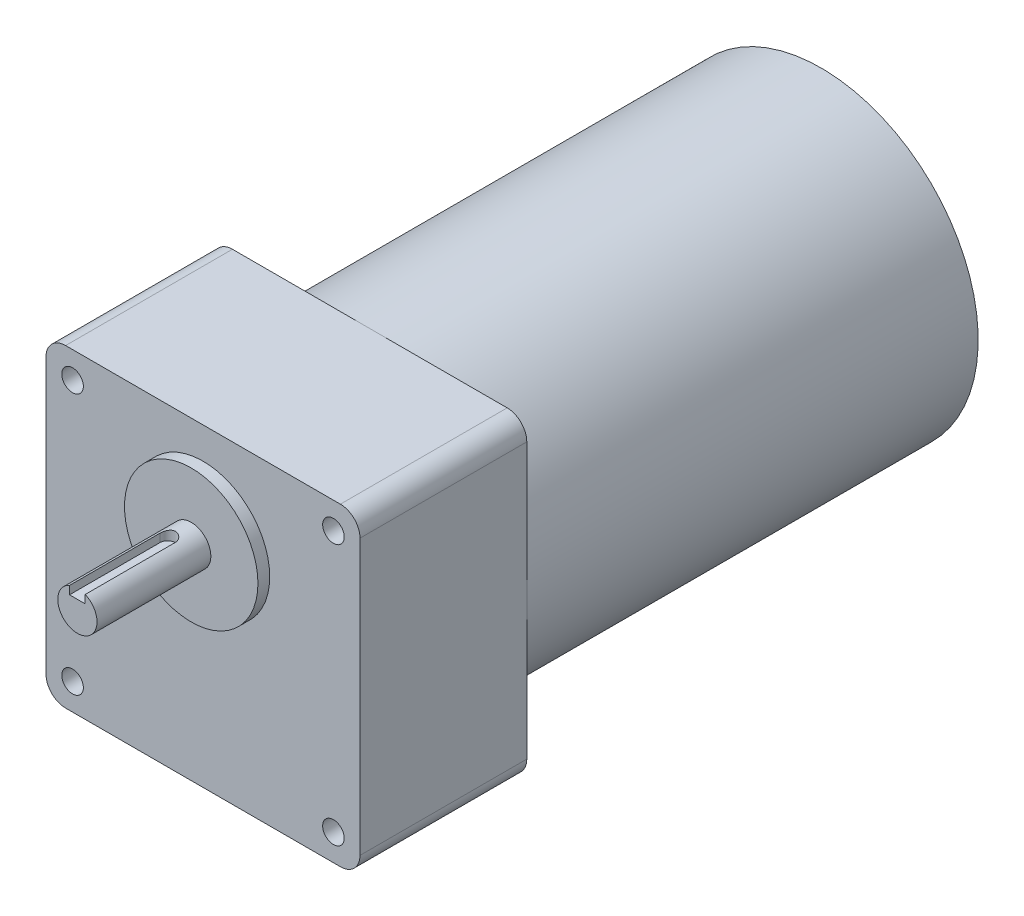
ISO-10303-21;
HEADER;
FILE_DESCRIPTION(('STEP AP214'),'2;1');
FILE_NAME('part.step','',(''),(''),'','','');
FILE_SCHEMA(('AUTOMOTIVE_DESIGN { 1 0 10303 214 1 1 1 1 }'));
ENDSEC;
DATA;
#1=APPLICATION_CONTEXT('core data for automotive mechanical design processes');
#2=APPLICATION_PROTOCOL_DEFINITION('international standard','automotive_design',2000,#1);
#3=PRODUCT_CONTEXT('',#1,'mechanical');
#4=PRODUCT('Part','Part','',(#3));
#5=PRODUCT_RELATED_PRODUCT_CATEGORY('part','',(#4));
#6=PRODUCT_DEFINITION_FORMATION('','',#4);
#7=PRODUCT_DEFINITION_CONTEXT('part definition',#1,'design');
#8=PRODUCT_DEFINITION('design','',#6,#7);
#9=PRODUCT_DEFINITION_SHAPE('','',#8);
#10=(LENGTH_UNIT() NAMED_UNIT(*) SI_UNIT(.MILLI.,.METRE.));
#11=(NAMED_UNIT(*) PLANE_ANGLE_UNIT() SI_UNIT($,.RADIAN.));
#12=(NAMED_UNIT(*) SI_UNIT($,.STERADIAN.) SOLID_ANGLE_UNIT());
#13=UNCERTAINTY_MEASURE_WITH_UNIT(LENGTH_MEASURE(1.E-05),#10,'distance_accuracy_value','');
#14=(GEOMETRIC_REPRESENTATION_CONTEXT(3) GLOBAL_UNCERTAINTY_ASSIGNED_CONTEXT((#13)) GLOBAL_UNIT_ASSIGNED_CONTEXT((#10,
#11,#12)) REPRESENTATION_CONTEXT('',''));
#15=CARTESIAN_POINT('',(0.,0.,0.));
#16=DIRECTION('',(0.,0.,1.));
#17=DIRECTION('',(1.,0.,0.));
#18=AXIS2_PLACEMENT_3D('',#15,#16,#17);
#19=CARTESIAN_POINT('',(0.,0.,-32.5));
#20=DIRECTION('',(0.,0.,-1.));
#21=DIRECTION('',(-1.,0.,0.));
#22=AXIS2_PLACEMENT_3D('',#19,#20,#21);
#23=PLANE('',#22);
#24=CARTESIAN_POINT('',(-33.2340187157677,33.2340187157677,-32.5));
#25=DIRECTION('',(0.,0.,-1.));
#26=DIRECTION('',(-1.,0.,0.));
#27=AXIS2_PLACEMENT_3D('',#24,#25,#26);
#28=CIRCLE('',#27,2.75);
#29=CARTESIAN_POINT('',(-35.9840187157677,33.2340187157677,-32.5));
#30=VERTEX_POINT('',#29);
#31=EDGE_CURVE('E273',#30,#30,#28,.T.);
#32=ORIENTED_EDGE('',*,*,#31,.F.);
#33=EDGE_LOOP('',(#32));
#34=FACE_BOUND('',#33,.T.);
#35=DIRECTION('',(0.,1.,0.));
#36=VECTOR('',#35,1.);
#37=CARTESIAN_POINT('',(-40.,-40.,-32.5));
#38=LINE('',#37,#36);
#39=CARTESIAN_POINT('',(-40.,0.,-32.5));
#40=VERTEX_POINT('',#39);
#41=CARTESIAN_POINT('',(-40.,35.,-32.5));
#42=VERTEX_POINT('',#41);
#43=EDGE_CURVE('E143',#40,#42,#38,.T.);
#44=ORIENTED_EDGE('',*,*,#43,.T.);
#45=CARTESIAN_POINT('',(-35.,35.,-32.5));
#46=DIRECTION('',(0.,0.,-1.));
#47=DIRECTION('',(-1.,0.,0.));
#48=AXIS2_PLACEMENT_3D('',#45,#46,#47);
#49=CIRCLE('',#48,5.);
#50=CARTESIAN_POINT('',(-35.,40.,-32.5));
#51=VERTEX_POINT('',#50);
#52=EDGE_CURVE('E351',#42,#51,#49,.T.);
#53=ORIENTED_EDGE('',*,*,#52,.T.);
#54=DIRECTION('',(1.,0.,0.));
#55=VECTOR('',#54,1.);
#56=CARTESIAN_POINT('',(-40.,40.,-32.5));
#57=LINE('',#56,#55);
#58=CARTESIAN_POINT('',(0.,40.,-32.5));
#59=VERTEX_POINT('',#58);
#60=EDGE_CURVE('E157',#51,#59,#57,.T.);
#61=ORIENTED_EDGE('',*,*,#60,.T.);
#62=CARTESIAN_POINT('',(0.,0.,-32.5));
#63=DIRECTION('',(0.,0.,-1.));
#64=DIRECTION('',(-1.,0.,0.));
#65=AXIS2_PLACEMENT_3D('',#62,#63,#64);
#66=CIRCLE('',#65,40.);
#67=EDGE_CURVE('E155',#40,#59,#66,.T.);
#68=ORIENTED_EDGE('',*,*,#67,.F.);
#69=EDGE_LOOP('',(#44,#53,#61,#68));
#70=FACE_BOUND('',#69,.T.);
#71=ADVANCED_FACE('F33',(#34,#70),#23,.T.);
#72=CARTESIAN_POINT('',(33.2340187157677,33.2340187157677,-32.5));
#73=DIRECTION('',(0.,0.,-1.));
#74=DIRECTION('',(-1.,0.,0.));
#75=AXIS2_PLACEMENT_3D('',#72,#73,#74);
#76=CIRCLE('',#75,2.75);
#77=CARTESIAN_POINT('',(30.4840187157677,33.2340187157677,-32.5));
#78=VERTEX_POINT('',#77);
#79=EDGE_CURVE('E276',#78,#78,#76,.T.);
#80=ORIENTED_EDGE('',*,*,#79,.F.);
#81=EDGE_LOOP('',(#80));
#82=FACE_BOUND('',#81,.T.);
#83=CARTESIAN_POINT('',(35.,40.,-32.5));
#84=VERTEX_POINT('',#83);
#85=EDGE_CURVE('E177',#59,#84,#57,.T.);
#86=ORIENTED_EDGE('',*,*,#85,.T.);
#87=CARTESIAN_POINT('',(35.,35.,-32.5));
#88=DIRECTION('',(0.,0.,-1.));
#89=DIRECTION('',(-1.,0.,0.));
#90=AXIS2_PLACEMENT_3D('',#87,#88,#89);
#91=CIRCLE('',#90,5.);
#92=CARTESIAN_POINT('',(40.,35.,-32.5));
#93=VERTEX_POINT('',#92);
#94=EDGE_CURVE('E11',#84,#93,#91,.T.);
#95=ORIENTED_EDGE('',*,*,#94,.T.);
#96=DIRECTION('',(0.,-1.,0.));
#97=VECTOR('',#96,1.);
#98=CARTESIAN_POINT('',(40.,40.,-32.5));
#99=LINE('',#98,#97);
#100=CARTESIAN_POINT('',(40.,0.,-32.5));
#101=VERTEX_POINT('',#100);
#102=EDGE_CURVE('E178',#93,#101,#99,.T.);
#103=ORIENTED_EDGE('',*,*,#102,.T.);
#104=EDGE_CURVE('E164',#59,#101,#66,.T.);
#105=ORIENTED_EDGE('',*,*,#104,.F.);
#106=EDGE_LOOP('',(#86,#95,#103,#105));
#107=FACE_BOUND('',#106,.T.);
#108=ADVANCED_FACE('F227',(#82,#107),#23,.T.);
#109=CARTESIAN_POINT('',(33.2340187157677,-33.2340187157677,-32.5));
#110=DIRECTION('',(0.,0.,-1.));
#111=DIRECTION('',(-1.,0.,0.));
#112=AXIS2_PLACEMENT_3D('',#109,#110,#111);
#113=CIRCLE('',#112,2.75);
#114=CARTESIAN_POINT('',(30.4840187157677,-33.2340187157677,-32.5));
#115=VERTEX_POINT('',#114);
#116=EDGE_CURVE('E255',#115,#115,#113,.T.);
#117=ORIENTED_EDGE('',*,*,#116,.F.);
#118=EDGE_LOOP('',(#117));
#119=FACE_BOUND('',#118,.T.);
#120=CARTESIAN_POINT('',(40.,-35.,-32.5));
#121=VERTEX_POINT('',#120);
#122=EDGE_CURVE('E176',#101,#121,#99,.T.);
#123=ORIENTED_EDGE('',*,*,#122,.T.);
#124=CARTESIAN_POINT('',(35.,-35.,-32.5));
#125=DIRECTION('',(0.,0.,-1.));
#126=DIRECTION('',(-1.,0.,0.));
#127=AXIS2_PLACEMENT_3D('',#124,#125,#126);
#128=CIRCLE('',#127,5.);
#129=CARTESIAN_POINT('',(35.,-40.,-32.5));
#130=VERTEX_POINT('',#129);
#131=EDGE_CURVE('E41',#121,#130,#128,.T.);
#132=ORIENTED_EDGE('',*,*,#131,.T.);
#133=DIRECTION('',(-1.,0.,0.));
#134=VECTOR('',#133,1.);
#135=CARTESIAN_POINT('',(40.,-40.,-32.5));
#136=LINE('',#135,#134);
#137=CARTESIAN_POINT('',(0.,-40.,-32.5));
#138=VERTEX_POINT('',#137);
#139=EDGE_CURVE('E153',#130,#138,#136,.T.);
#140=ORIENTED_EDGE('',*,*,#139,.T.);
#141=EDGE_CURVE('E168',#101,#138,#66,.T.);
#142=ORIENTED_EDGE('',*,*,#141,.F.);
#143=EDGE_LOOP('',(#123,#132,#140,#142));
#144=FACE_BOUND('',#143,.T.);
#145=ADVANCED_FACE('F232',(#119,#144),#23,.T.);
#146=CARTESIAN_POINT('',(40.,40.,10.));
#147=DIRECTION('',(-1.,0.,0.));
#148=DIRECTION('',(0.,0.,1.));
#149=AXIS2_PLACEMENT_3D('',#146,#147,#148);
#150=PLANE('',#149);
#151=DIRECTION('',(0.,1.,0.));
#152=VECTOR('',#151,1.);
#153=CARTESIAN_POINT('',(40.,40.,10.));
#154=LINE('',#153,#152);
#155=CARTESIAN_POINT('',(40.,-35.,10.));
#156=VERTEX_POINT('',#155);
#157=CARTESIAN_POINT('',(40.,35.,10.));
#158=VERTEX_POINT('',#157);
#159=EDGE_CURVE('E321',#156,#158,#154,.T.);
#160=ORIENTED_EDGE('',*,*,#159,.F.);
#161=DIRECTION('',(0.,0.,-1.));
#162=VECTOR('',#161,1.);
#163=CARTESIAN_POINT('',(40.,-35.,10.));
#164=LINE('',#163,#162);
#165=EDGE_CURVE('E261',#156,#121,#164,.T.);
#166=ORIENTED_EDGE('',*,*,#165,.T.);
#167=ORIENTED_EDGE('',*,*,#122,.F.);
#168=ORIENTED_EDGE('',*,*,#102,.F.);
#169=DIRECTION('',(0.,0.,-1.));
#170=VECTOR('',#169,1.);
#171=CARTESIAN_POINT('',(40.,35.,10.));
#172=LINE('',#171,#170);
#173=EDGE_CURVE('E339',#93,#158,#172,.F.);
#174=ORIENTED_EDGE('',*,*,#173,.T.);
#175=EDGE_LOOP('',(#160,#166,#167,#168,#174));
#176=FACE_BOUND('',#175,.T.);
#177=ADVANCED_FACE('F244',(#176),#150,.F.);
#178=CARTESIAN_POINT('',(-40.,40.,10.));
#179=DIRECTION('',(0.,-1.,0.));
#180=DIRECTION('',(0.,0.,-1.));
#181=AXIS2_PLACEMENT_3D('',#178,#179,#180);
#182=PLANE('',#181);
#183=ORIENTED_EDGE('',*,*,#60,.F.);
#184=DIRECTION('',(0.,0.,-1.));
#185=VECTOR('',#184,1.);
#186=CARTESIAN_POINT('',(-35.,40.,10.));
#187=LINE('',#186,#185);
#188=CARTESIAN_POINT('',(-35.,40.,10.));
#189=VERTEX_POINT('',#188);
#190=EDGE_CURVE('E326',#51,#189,#187,.F.);
#191=ORIENTED_EDGE('',*,*,#190,.T.);
#192=DIRECTION('',(-1.,0.,0.));
#193=VECTOR('',#192,1.);
#194=CARTESIAN_POINT('',(-40.,40.,10.));
#195=LINE('',#194,#193);
#196=CARTESIAN_POINT('',(35.,40.,10.));
#197=VERTEX_POINT('',#196);
#198=EDGE_CURVE('E310',#197,#189,#195,.T.);
#199=ORIENTED_EDGE('',*,*,#198,.F.);
#200=DIRECTION('',(0.,0.,-1.));
#201=VECTOR('',#200,1.);
#202=CARTESIAN_POINT('',(35.,40.,10.));
#203=LINE('',#202,#201);
#204=EDGE_CURVE('E346',#197,#84,#203,.T.);
#205=ORIENTED_EDGE('',*,*,#204,.T.);
#206=ORIENTED_EDGE('',*,*,#85,.F.);
#207=EDGE_LOOP('',(#183,#191,#199,#205,#206));
#208=FACE_BOUND('',#207,.T.);
#209=ADVANCED_FACE('F249',(#208),#182,.F.);
#210=CARTESIAN_POINT('',(-40.,40.,10.));
#211=DIRECTION('',(1.,0.,0.));
#212=DIRECTION('',(0.,1.,0.));
#213=AXIS2_PLACEMENT_3D('',#210,#211,#212);
#214=PLANE('',#213);
#215=DIRECTION('',(0.,-1.,0.));
#216=VECTOR('',#215,1.);
#217=CARTESIAN_POINT('',(-40.,40.,10.));
#218=LINE('',#217,#216);
#219=CARTESIAN_POINT('',(-40.,35.,10.));
#220=VERTEX_POINT('',#219);
#221=CARTESIAN_POINT('',(-40.,-35.,10.));
#222=VERTEX_POINT('',#221);
#223=EDGE_CURVE('E320',#220,#222,#218,.T.);
#224=ORIENTED_EDGE('',*,*,#223,.F.);
#225=DIRECTION('',(0.,0.,-1.));
#226=VECTOR('',#225,1.);
#227=CARTESIAN_POINT('',(-40.,35.,10.));
#228=LINE('',#227,#226);
#229=EDGE_CURVE('E151',#220,#42,#228,.T.);
#230=ORIENTED_EDGE('',*,*,#229,.T.);
#231=ORIENTED_EDGE('',*,*,#43,.F.);
#232=CARTESIAN_POINT('',(-40.,-35.,-32.5));
#233=VERTEX_POINT('',#232);
#234=EDGE_CURVE('E132',#233,#40,#38,.T.);
#235=ORIENTED_EDGE('',*,*,#234,.F.);
#236=DIRECTION('',(0.,0.,-1.));
#237=VECTOR('',#236,1.);
#238=CARTESIAN_POINT('',(-40.,-35.,10.));
#239=LINE('',#238,#237);
#240=EDGE_CURVE('E265',#233,#222,#239,.F.);
#241=ORIENTED_EDGE('',*,*,#240,.T.);
#242=EDGE_LOOP('',(#224,#230,#231,#235,#241));
#243=FACE_BOUND('',#242,.T.);
#244=ADVANCED_FACE('F149',(#243),#214,.F.);
#245=CARTESIAN_POINT('',(-40.,-40.,10.));
#246=DIRECTION('',(0.,1.,0.));
#247=DIRECTION('',(0.,0.,1.));
#248=AXIS2_PLACEMENT_3D('',#245,#246,#247);
#249=PLANE('',#248);
#250=DIRECTION('',(1.,0.,0.));
#251=VECTOR('',#250,1.);
#252=CARTESIAN_POINT('',(-40.,-40.,10.));
#253=LINE('',#252,#251);
#254=CARTESIAN_POINT('',(-35.,-40.,10.));
#255=VERTEX_POINT('',#254);
#256=CARTESIAN_POINT('',(35.,-40.,10.));
#257=VERTEX_POINT('',#256);
#258=EDGE_CURVE('E356',#255,#257,#253,.T.);
#259=ORIENTED_EDGE('',*,*,#258,.F.);
#260=DIRECTION('',(0.,0.,-1.));
#261=VECTOR('',#260,1.);
#262=CARTESIAN_POINT('',(-35.,-40.,10.));
#263=LINE('',#262,#261);
#264=CARTESIAN_POINT('',(-35.,-40.,-32.5));
#265=VERTEX_POINT('',#264);
#266=EDGE_CURVE('E330',#255,#265,#263,.T.);
#267=ORIENTED_EDGE('',*,*,#266,.T.);
#268=EDGE_CURVE('E180',#138,#265,#136,.T.);
#269=ORIENTED_EDGE('',*,*,#268,.F.);
#270=ORIENTED_EDGE('',*,*,#139,.F.);
#271=DIRECTION('',(0.,0.,-1.));
#272=VECTOR('',#271,1.);
#273=CARTESIAN_POINT('',(35.,-40.,10.));
#274=LINE('',#273,#272);
#275=EDGE_CURVE('E327',#130,#257,#274,.F.);
#276=ORIENTED_EDGE('',*,*,#275,.T.);
#277=EDGE_LOOP('',(#259,#267,#269,#270,#276));
#278=FACE_BOUND('',#277,.T.);
#279=ADVANCED_FACE('F299',(#278),#249,.F.);
#280=CARTESIAN_POINT('',(0.,0.,10.));
#281=DIRECTION('',(0.,0.,1.));
#282=DIRECTION('',(1.,0.,0.));
#283=AXIS2_PLACEMENT_3D('',#280,#281,#282);
#284=PLANE('',#283);
#285=CARTESIAN_POINT('',(33.2340187157677,-33.2340187157677,10.));
#286=DIRECTION('',(0.,0.,1.));
#287=DIRECTION('',(1.,0.,0.));
#288=AXIS2_PLACEMENT_3D('',#285,#286,#287);
#289=CIRCLE('',#288,2.75);
#290=CARTESIAN_POINT('',(35.9840187157677,-33.2340187157677,10.));
#291=VERTEX_POINT('',#290);
#292=EDGE_CURVE('E284',#291,#291,#289,.T.);
#293=ORIENTED_EDGE('',*,*,#292,.F.);
#294=EDGE_LOOP('',(#293));
#295=FACE_BOUND('',#294,.T.);
#296=CARTESIAN_POINT('',(-33.2340187157677,-33.2340187157677,10.));
#297=DIRECTION('',(0.,0.,1.));
#298=DIRECTION('',(1.,0.,0.));
#299=AXIS2_PLACEMENT_3D('',#296,#297,#298);
#300=CIRCLE('',#299,2.75);
#301=CARTESIAN_POINT('',(-30.4840187157677,-33.2340187157677,10.));
#302=VERTEX_POINT('',#301);
#303=EDGE_CURVE('E287',#302,#302,#300,.T.);
#304=ORIENTED_EDGE('',*,*,#303,.F.);
#305=EDGE_LOOP('',(#304));
#306=FACE_BOUND('',#305,.T.);
#307=CARTESIAN_POINT('',(-33.2340187157677,33.2340187157677,10.));
#308=DIRECTION('',(0.,0.,1.));
#309=DIRECTION('',(1.,0.,0.));
#310=AXIS2_PLACEMENT_3D('',#307,#308,#309);
#311=CIRCLE('',#310,2.75);
#312=CARTESIAN_POINT('',(-30.4840187157677,33.2340187157677,10.));
#313=VERTEX_POINT('',#312);
#314=EDGE_CURVE('E283',#313,#313,#311,.T.);
#315=ORIENTED_EDGE('',*,*,#314,.F.);
#316=EDGE_LOOP('',(#315));
#317=FACE_BOUND('',#316,.T.);
#318=CARTESIAN_POINT('',(33.2340187157677,33.2340187157677,10.));
#319=DIRECTION('',(0.,0.,1.));
#320=DIRECTION('',(1.,0.,0.));
#321=AXIS2_PLACEMENT_3D('',#318,#319,#320);
#322=CIRCLE('',#321,2.75);
#323=CARTESIAN_POINT('',(35.9840187157677,33.2340187157677,10.));
#324=VERTEX_POINT('',#323);
#325=EDGE_CURVE('E280',#324,#324,#322,.T.);
#326=ORIENTED_EDGE('',*,*,#325,.F.);
#327=EDGE_LOOP('',(#326));
#328=FACE_BOUND('',#327,.T.);
#329=CARTESIAN_POINT('',(0.,15.,10.));
#330=DIRECTION('',(0.,0.,1.));
#331=DIRECTION('',(1.,0.,0.));
#332=AXIS2_PLACEMENT_3D('',#329,#330,#331);
#333=CIRCLE('',#332,17.);
#334=CARTESIAN_POINT('',(17.,15.,10.));
#335=VERTEX_POINT('',#334);
#336=EDGE_CURVE('E307',#335,#335,#333,.T.);
#337=ORIENTED_EDGE('',*,*,#336,.F.);
#338=EDGE_LOOP('',(#337));
#339=FACE_BOUND('',#338,.T.);
#340=ORIENTED_EDGE('',*,*,#198,.T.);
#341=CARTESIAN_POINT('',(-35.,35.,10.));
#342=DIRECTION('',(0.,0.,1.));
#343=DIRECTION('',(1.,0.,0.));
#344=AXIS2_PLACEMENT_3D('',#341,#342,#343);
#345=CIRCLE('',#344,5.);
#346=EDGE_CURVE('E313',#189,#220,#345,.T.);
#347=ORIENTED_EDGE('',*,*,#346,.T.);
#348=ORIENTED_EDGE('',*,*,#223,.T.);
#349=CARTESIAN_POINT('',(-35.,-35.,10.));
#350=DIRECTION('',(0.,0.,1.));
#351=DIRECTION('',(1.,0.,0.));
#352=AXIS2_PLACEMENT_3D('',#349,#350,#351);
#353=CIRCLE('',#352,5.);
#354=EDGE_CURVE('E328',#222,#255,#353,.T.);
#355=ORIENTED_EDGE('',*,*,#354,.T.);
#356=ORIENTED_EDGE('',*,*,#258,.T.);
#357=CARTESIAN_POINT('',(35.,-35.,10.));
#358=DIRECTION('',(0.,0.,1.));
#359=DIRECTION('',(1.,0.,0.));
#360=AXIS2_PLACEMENT_3D('',#357,#358,#359);
#361=CIRCLE('',#360,5.);
#362=EDGE_CURVE('E332',#257,#156,#361,.T.);
#363=ORIENTED_EDGE('',*,*,#362,.T.);
#364=ORIENTED_EDGE('',*,*,#159,.T.);
#365=CARTESIAN_POINT('',(35.,35.,10.));
#366=DIRECTION('',(0.,0.,1.));
#367=DIRECTION('',(1.,0.,0.));
#368=AXIS2_PLACEMENT_3D('',#365,#366,#367);
#369=CIRCLE('',#368,5.);
#370=EDGE_CURVE('E316',#158,#197,#369,.T.);
#371=ORIENTED_EDGE('',*,*,#370,.T.);
#372=EDGE_LOOP('',(#340,#347,#348,#355,#356,#363,#364,#371));
#373=FACE_BOUND('',#372,.T.);
#374=ADVANCED_FACE('F295',(#295,#306,#317,#328,#339,#373),#284,.T.);
#375=CARTESIAN_POINT('',(0.,15.,13.));
#376=DIRECTION('',(0.,0.,-1.));
#377=DIRECTION('',(-1.,0.,0.));
#378=AXIS2_PLACEMENT_3D('',#375,#376,#377);
#379=CYLINDRICAL_SURFACE('',#378,17.);
#380=CARTESIAN_POINT('',(0.,15.,13.));
#381=DIRECTION('',(0.,0.,1.));
#382=DIRECTION('',(1.,0.,0.));
#383=AXIS2_PLACEMENT_3D('',#380,#381,#382);
#384=CIRCLE('',#383,17.);
#385=CARTESIAN_POINT('',(17.,15.,13.));
#386=VERTEX_POINT('',#385);
#387=EDGE_CURVE('E344',#386,#386,#384,.T.);
#388=ORIENTED_EDGE('',*,*,#387,.F.);
#389=EDGE_LOOP('',(#388));
#390=FACE_BOUND('',#389,.T.);
#391=ORIENTED_EDGE('',*,*,#336,.T.);
#392=EDGE_LOOP('',(#391));
#393=FACE_BOUND('',#392,.T.);
#394=ADVANCED_FACE('F298',(#390,#393),#379,.T.);
#395=CARTESIAN_POINT('',(0.,15.,13.));
#396=DIRECTION('',(0.,0.,1.));
#397=DIRECTION('',(1.,0.,0.));
#398=AXIS2_PLACEMENT_3D('',#395,#396,#397);
#399=PLANE('',#398);
#400=CARTESIAN_POINT('',(0.,15.,13.));
#401=DIRECTION('',(0.,0.,1.));
#402=DIRECTION('',(1.,0.,0.));
#403=AXIS2_PLACEMENT_3D('',#400,#401,#402);
#404=CIRCLE('',#403,5.);
#405=CARTESIAN_POINT('',(5.,15.,13.));
#406=VERTEX_POINT('',#405);
#407=EDGE_CURVE('E170',#406,#406,#404,.T.);
#408=ORIENTED_EDGE('',*,*,#407,.F.);
#409=EDGE_LOOP('',(#408));
#410=FACE_BOUND('',#409,.T.);
#411=ORIENTED_EDGE('',*,*,#387,.T.);
#412=EDGE_LOOP('',(#411));
#413=FACE_BOUND('',#412,.T.);
#414=ADVANCED_FACE('F223',(#410,#413),#399,.T.);
#415=CARTESIAN_POINT('',(0.,15.,42.));
#416=DIRECTION('',(0.,0.,-1.));
#417=DIRECTION('',(-1.,0.,0.));
#418=AXIS2_PLACEMENT_3D('',#415,#416,#417);
#419=CYLINDRICAL_SURFACE('',#418,5.);
#420=DIRECTION('',(0.,0.,-1.));
#421=VECTOR('',#420,1.);
#422=CARTESIAN_POINT('',(-2.,19.5825756949558,42.));
#423=LINE('',#422,#421);
#424=CARTESIAN_POINT('',(-2.,19.5825756949558,42.));
#425=VERTEX_POINT('',#424);
#426=CARTESIAN_POINT('',(-2.,19.5825756949558,19.));
#427=VERTEX_POINT('',#426);
#428=EDGE_CURVE('E367',#425,#427,#423,.T.);
#429=ORIENTED_EDGE('',*,*,#428,.T.);
#430=CARTESIAN_POINT('',(-2.,19.5825756949558,19.));
#431=CARTESIAN_POINT('',(-2.00000798036347,19.5825646447038,18.9461941474974));
#432=CARTESIAN_POINT('',(-1.99782891366025,19.5835230607732,18.8923943344424));
#433=CARTESIAN_POINT('',(-1.98915905973447,19.5872962541754,18.7852287017453));
#434=CARTESIAN_POINT('',(-1.98266991468792,19.5901103244855,18.731862724644));
#435=CARTESIAN_POINT('',(-1.9654760367637,19.5974978292064,18.6261531784412));
#436=CARTESIAN_POINT('',(-1.95478796820434,19.6020643071753,18.573806415956));
#437=CARTESIAN_POINT('',(-1.9293163019066,19.6128005329668,18.4702992282855));
#438=CARTESIAN_POINT('',(-1.9145324541709,19.618970378654,18.4191388757228));
#439=CARTESIAN_POINT('',(-1.86426971793523,19.6395929124842,18.268064149418));
#440=CARTESIAN_POINT('',(-1.82284489460008,19.6561744915743,18.1703457693103));
#441=CARTESIAN_POINT('',(-1.72548191592176,19.6931237076538,17.9832044199174));
#442=CARTESIAN_POINT('',(-1.66952996336925,19.7134949386401,17.8937894470383));
#443=CARTESIAN_POINT('',(-1.54131835736854,19.7570099940211,17.7207376033258));
#444=CARTESIAN_POINT('',(-1.4683691399273,19.7802424563552,17.6376327830798));
#445=CARTESIAN_POINT('',(-1.30969646176209,19.8261279054866,17.4844597277893));
#446=CARTESIAN_POINT('',(-1.22397038499682,19.8487807724972,17.4143941691343));
#447=CARTESIAN_POINT('',(-1.03800590808969,19.8920341710608,17.2865936058044));
#448=CARTESIAN_POINT('',(-0.937327933050965,19.9125182454353,17.2294551907381));
#449=CARTESIAN_POINT('',(-0.726824143246712,19.94803944125,17.1331559273114));
#450=CARTESIAN_POINT('',(-0.617002169026246,19.9630788354418,17.0939875759483));
#451=CARTESIAN_POINT('',(-0.396967441295692,19.9853831465382,17.0366587986894));
#452=CARTESIAN_POINT('',(-0.28703105452306,19.9929892254793,17.0175730490943));
#453=CARTESIAN_POINT('',(-0.0652684304565162,20.0008031020109,16.9979715200544));
#454=CARTESIAN_POINT('',(0.0465571232841648,20.0010135205303,16.9974491619765));
#455=CARTESIAN_POINT('',(0.262233376226783,19.994219600453,17.0144828391599));
#456=CARTESIAN_POINT('',(0.36617920250679,19.9876198558546,17.031025046674));
#457=CARTESIAN_POINT('',(0.569674786500929,19.9684927044145,17.0799934270535));
#458=CARTESIAN_POINT('',(0.669224295072842,19.9559649620993,17.1124204988686));
#459=CARTESIAN_POINT('',(0.862897539070296,19.9259683059879,17.1926362964245));
#460=CARTESIAN_POINT('',(0.95691685136644,19.9084277475585,17.2406492408105));
#461=CARTESIAN_POINT('',(1.13580746919776,19.8701460200804,17.3504645885952));
#462=CARTESIAN_POINT('',(1.22067554984698,19.8494037289645,17.4122718296906));
#463=CARTESIAN_POINT('',(1.38476339273627,19.8052178274614,17.5526441802585));
#464=CARTESIAN_POINT('',(1.4632477030894,19.7816862717288,17.63204247467));
#465=CARTESIAN_POINT('',(1.60609926099478,19.7356195058465,17.8029800951477));
#466=CARTESIAN_POINT('',(1.67046007709005,19.7130847533278,17.8945249220943));
#467=CARTESIAN_POINT('',(1.78493657933605,19.6709568885602,18.0904702840212));
#468=CARTESIAN_POINT('',(1.83458932217622,19.6514670215058,18.1951648366602));
#469=CARTESIAN_POINT('',(1.91521298357264,19.6188610505958,18.4123615244295));
#470=CARTESIAN_POINT('',(1.94621696002208,19.6057336762874,18.5248494473383));
#471=CARTESIAN_POINT('',(1.9781058182572,19.5920830352949,18.698743634158));
#472=CARTESIAN_POINT('',(1.98630505165979,19.5885343768053,18.7586575493013));
#473=CARTESIAN_POINT('',(1.99725282103812,19.5837754031439,18.8790350189955));
#474=CARTESIAN_POINT('',(2.00000471568568,19.5825636471174,18.9394982117578));
#475=CARTESIAN_POINT('',(2.,19.5825756949558,19.));
#476=B_SPLINE_CURVE_WITH_KNOTS('',3,(#430,#431,#432,#433,#434,#435,#436,#437,#438,#439,#440,
#441,#442,#443,#444,#445,#446,#447,#448,#449,#450,#451,#452,#453,#454,#455,#456,#457,#458,#459,
#460,#461,#462,#463,#464,#465,#466,#467,#468,#469,#470,#471,#472,#473,#474,#475),.UNSPECIFIED.,
.F.,.F.,(4,2,2,2,2,2,2,2,2,2,2,2,2,2,2,2,2,2,2,2,2,2,4),(0.,0.161354853098821,0.322648263883208,
0.48330791125188,0.643977367092306,0.964683001739093,1.28569434942626,1.62318047995498,
1.96073580539191,2.31162858925763,2.66237473197322,2.9961387650427,3.32978451514656,
3.64468915259535,3.95961161305654,4.27928176927547,4.59906421133019,4.93981874675153,
5.28072813203934,5.63144241548463,5.98153315592125,6.16300192557813,6.34435877193561),.UNSPECIFIED.);
#477=CARTESIAN_POINT('',(2.,19.5825756949558,19.));
#478=VERTEX_POINT('',#477);
#479=EDGE_CURVE('E184',#427,#478,#476,.T.);
#480=ORIENTED_EDGE('',*,*,#479,.T.);
#481=DIRECTION('',(0.,0.,-1.));
#482=VECTOR('',#481,1.);
#483=CARTESIAN_POINT('',(2.,19.5825756949558,42.));
#484=LINE('',#483,#482);
#485=CARTESIAN_POINT('',(2.,19.5825756949558,42.));
#486=VERTEX_POINT('',#485);
#487=EDGE_CURVE('E370',#478,#486,#484,.F.);
#488=ORIENTED_EDGE('',*,*,#487,.T.);
#489=CARTESIAN_POINT('',(0.,15.,42.));
#490=DIRECTION('',(0.,0.,1.));
#491=DIRECTION('',(1.,0.,0.));
#492=AXIS2_PLACEMENT_3D('',#489,#490,#491);
#493=CIRCLE('',#492,5.);
#494=EDGE_CURVE('E362',#425,#486,#493,.T.);
#495=ORIENTED_EDGE('',*,*,#494,.F.);
#496=EDGE_LOOP('',(#429,#480,#488,#495));
#497=FACE_BOUND('',#496,.T.);
#498=ORIENTED_EDGE('',*,*,#407,.T.);
#499=EDGE_LOOP('',(#498));
#500=FACE_BOUND('',#499,.T.);
#501=ADVANCED_FACE('F195',(#497,#500),#419,.T.);
#502=CARTESIAN_POINT('',(0.,15.,42.));
#503=DIRECTION('',(0.,0.,1.));
#504=DIRECTION('',(1.,0.,0.));
#505=AXIS2_PLACEMENT_3D('',#502,#503,#504);
#506=PLANE('',#505);
#507=DIRECTION('',(0.,-1.,0.));
#508=VECTOR('',#507,1.);
#509=CARTESIAN_POINT('',(-2.,15.,42.));
#510=LINE('',#509,#508);
#511=CARTESIAN_POINT('',(-2.,17.5,42.));
#512=VERTEX_POINT('',#511);
#513=EDGE_CURVE('E169',#425,#512,#510,.T.);
#514=ORIENTED_EDGE('',*,*,#513,.F.);
#515=ORIENTED_EDGE('',*,*,#494,.T.);
#516=DIRECTION('',(0.,1.,0.));
#517=VECTOR('',#516,1.);
#518=CARTESIAN_POINT('',(2.,20.9126834756614,42.));
#519=LINE('',#518,#517);
#520=CARTESIAN_POINT('',(2.,17.5,42.));
#521=VERTEX_POINT('',#520);
#522=EDGE_CURVE('E192',#521,#486,#519,.T.);
#523=ORIENTED_EDGE('',*,*,#522,.F.);
#524=DIRECTION('',(1.,0.,0.));
#525=VECTOR('',#524,1.);
#526=CARTESIAN_POINT('',(0.,17.5,42.));
#527=LINE('',#526,#525);
#528=EDGE_CURVE('E379',#512,#521,#527,.T.);
#529=ORIENTED_EDGE('',*,*,#528,.F.);
#530=EDGE_LOOP('',(#514,#515,#523,#529));
#531=FACE_BOUND('',#530,.T.);
#532=ADVANCED_FACE('F214',(#531),#506,.T.);
#533=CARTESIAN_POINT('',(-2.,17.5,19.));
#534=DIRECTION('',(-1.,0.,0.));
#535=DIRECTION('',(0.,0.,1.));
#536=AXIS2_PLACEMENT_3D('',#533,#534,#535);
#537=PLANE('',#536);
#538=ORIENTED_EDGE('',*,*,#513,.T.);
#539=DIRECTION('',(0.,0.,1.));
#540=VECTOR('',#539,1.);
#541=CARTESIAN_POINT('',(-2.,17.5,19.));
#542=LINE('',#541,#540);
#543=CARTESIAN_POINT('',(-2.,17.5,19.));
#544=VERTEX_POINT('',#543);
#545=EDGE_CURVE('E373',#544,#512,#542,.T.);
#546=ORIENTED_EDGE('',*,*,#545,.F.);
#547=DIRECTION('',(0.,-1.,0.));
#548=VECTOR('',#547,1.);
#549=CARTESIAN_POINT('',(-2.,17.5,19.));
#550=LINE('',#549,#548);
#551=EDGE_CURVE('E376',#427,#544,#550,.T.);
#552=ORIENTED_EDGE('',*,*,#551,.F.);
#553=ORIENTED_EDGE('',*,*,#428,.F.);
#554=EDGE_LOOP('',(#538,#546,#552,#553));
#555=FACE_BOUND('',#554,.T.);
#556=ADVANCED_FACE('F211',(#555),#537,.F.);
#557=CARTESIAN_POINT('',(2.,20.9126834756614,19.));
#558=DIRECTION('',(1.,0.,0.));
#559=DIRECTION('',(0.,0.,-1.));
#560=AXIS2_PLACEMENT_3D('',#557,#558,#559);
#561=PLANE('',#560);
#562=DIRECTION('',(0.,1.,0.));
#563=VECTOR('',#562,1.);
#564=CARTESIAN_POINT('',(2.,20.9126834756614,19.));
#565=LINE('',#564,#563);
#566=CARTESIAN_POINT('',(2.,17.5,19.));
#567=VERTEX_POINT('',#566);
#568=EDGE_CURVE('E193',#567,#478,#565,.T.);
#569=ORIENTED_EDGE('',*,*,#568,.F.);
#570=DIRECTION('',(0.,0.,1.));
#571=VECTOR('',#570,1.);
#572=CARTESIAN_POINT('',(2.,17.5,19.));
#573=LINE('',#572,#571);
#574=EDGE_CURVE('E374',#567,#521,#573,.T.);
#575=ORIENTED_EDGE('',*,*,#574,.T.);
#576=ORIENTED_EDGE('',*,*,#522,.T.);
#577=ORIENTED_EDGE('',*,*,#487,.F.);
#578=EDGE_LOOP('',(#569,#575,#576,#577));
#579=FACE_BOUND('',#578,.T.);
#580=ADVANCED_FACE('F209',(#579),#561,.F.);
#581=CARTESIAN_POINT('',(0.,17.5,19.));
#582=DIRECTION('',(0.,-1.,0.));
#583=DIRECTION('',(0.,0.,-1.));
#584=AXIS2_PLACEMENT_3D('',#581,#582,#583);
#585=PLANE('',#584);
#586=ORIENTED_EDGE('',*,*,#528,.T.);
#587=ORIENTED_EDGE('',*,*,#574,.F.);
#588=CARTESIAN_POINT('',(0.,17.5,19.));
#589=DIRECTION('',(0.,1.,0.));
#590=DIRECTION('',(0.,0.,-1.));
#591=AXIS2_PLACEMENT_3D('',#588,#589,#590);
#592=CIRCLE('',#591,2.);
#593=EDGE_CURVE('E142',#567,#544,#592,.T.);
#594=ORIENTED_EDGE('',*,*,#593,.T.);
#595=ORIENTED_EDGE('',*,*,#545,.T.);
#596=EDGE_LOOP('',(#586,#587,#594,#595));
#597=FACE_BOUND('',#596,.T.);
#598=ADVANCED_FACE('F204',(#597),#585,.F.);
#599=CARTESIAN_POINT('',(0.,17.5,19.));
#600=DIRECTION('',(0.,1.,0.));
#601=DIRECTION('',(0.,0.,1.));
#602=AXIS2_PLACEMENT_3D('',#599,#600,#601);
#603=CYLINDRICAL_SURFACE('',#602,2.);
#604=ORIENTED_EDGE('',*,*,#551,.T.);
#605=ORIENTED_EDGE('',*,*,#593,.F.);
#606=ORIENTED_EDGE('',*,*,#568,.T.);
#607=ORIENTED_EDGE('',*,*,#479,.F.);
#608=EDGE_LOOP('',(#604,#605,#606,#607));
#609=FACE_BOUND('',#608,.T.);
#610=ADVANCED_FACE('F199',(#609),#603,.F.);
#611=CARTESIAN_POINT('',(-33.2340187157677,-33.2340187157677,-32.5));
#612=DIRECTION('',(0.,0.,-1.));
#613=DIRECTION('',(-1.,0.,0.));
#614=AXIS2_PLACEMENT_3D('',#611,#612,#613);
#615=CIRCLE('',#614,2.75);
#616=CARTESIAN_POINT('',(-35.9840187157677,-33.2340187157677,-32.5));
#617=VERTEX_POINT('',#616);
#618=EDGE_CURVE('E279',#617,#617,#615,.T.);
#619=ORIENTED_EDGE('',*,*,#618,.F.);
#620=EDGE_LOOP('',(#619));
#621=FACE_BOUND('',#620,.T.);
#622=ORIENTED_EDGE('',*,*,#268,.T.);
#623=CARTESIAN_POINT('',(-35.,-35.,-32.5));
#624=DIRECTION('',(0.,0.,-1.));
#625=DIRECTION('',(-1.,0.,0.));
#626=AXIS2_PLACEMENT_3D('',#623,#624,#625);
#627=CIRCLE('',#626,5.);
#628=EDGE_CURVE('E139',#265,#233,#627,.T.);
#629=ORIENTED_EDGE('',*,*,#628,.T.);
#630=ORIENTED_EDGE('',*,*,#234,.T.);
#631=EDGE_CURVE('E137',#138,#40,#66,.T.);
#632=ORIENTED_EDGE('',*,*,#631,.F.);
#633=EDGE_LOOP('',(#622,#629,#630,#632));
#634=FACE_BOUND('',#633,.T.);
#635=ADVANCED_FACE('F135',(#621,#634),#23,.T.);
#636=CARTESIAN_POINT('',(0.,0.,-147.5));
#637=DIRECTION('',(0.,0.,1.));
#638=DIRECTION('',(1.,0.,0.));
#639=AXIS2_PLACEMENT_3D('',#636,#637,#638);
#640=CYLINDRICAL_SURFACE('',#639,40.);
#641=CARTESIAN_POINT('',(0.,0.,-147.5));
#642=DIRECTION('',(0.,0.,-1.));
#643=DIRECTION('',(-1.,0.,0.));
#644=AXIS2_PLACEMENT_3D('',#641,#642,#643);
#645=CIRCLE('',#644,40.);
#646=CARTESIAN_POINT('',(-40.,0.,-147.5));
#647=VERTEX_POINT('',#646);
#648=EDGE_CURVE('E161',#647,#647,#645,.T.);
#649=ORIENTED_EDGE('',*,*,#648,.F.);
#650=EDGE_LOOP('',(#649));
#651=FACE_BOUND('',#650,.T.);
#652=ORIENTED_EDGE('',*,*,#67,.T.);
#653=ORIENTED_EDGE('',*,*,#104,.T.);
#654=ORIENTED_EDGE('',*,*,#141,.T.);
#655=ORIENTED_EDGE('',*,*,#631,.T.);
#656=EDGE_LOOP('',(#652,#653,#654,#655));
#657=FACE_BOUND('',#656,.T.);
#658=ADVANCED_FACE('F166',(#651,#657),#640,.T.);
#659=CARTESIAN_POINT('',(0.,0.,-147.5));
#660=DIRECTION('',(0.,0.,-1.));
#661=DIRECTION('',(-1.,0.,0.));
#662=AXIS2_PLACEMENT_3D('',#659,#660,#661);
#663=PLANE('',#662);
#664=CARTESIAN_POINT('',(0.,0.,-147.5));
#665=DIRECTION('',(0.,0.,-1.));
#666=DIRECTION('',(-1.,0.,0.));
#667=AXIS2_PLACEMENT_3D('',#664,#665,#666);
#668=CIRCLE('',#667,14.);
#669=CARTESIAN_POINT('',(-14.,0.,-147.5));
#670=VERTEX_POINT('',#669);
#671=EDGE_CURVE('E263',#670,#670,#668,.T.);
#672=ORIENTED_EDGE('',*,*,#671,.F.);
#673=EDGE_LOOP('',(#672));
#674=FACE_BOUND('',#673,.T.);
#675=ORIENTED_EDGE('',*,*,#648,.T.);
#676=EDGE_LOOP('',(#675));
#677=FACE_BOUND('',#676,.T.);
#678=ADVANCED_FACE('F240',(#674,#677),#663,.T.);
#679=CARTESIAN_POINT('',(0.,0.,-152.5));
#680=DIRECTION('',(0.,0.,1.));
#681=DIRECTION('',(1.,0.,0.));
#682=AXIS2_PLACEMENT_3D('',#679,#680,#681);
#683=CYLINDRICAL_SURFACE('',#682,14.);
#684=CARTESIAN_POINT('',(0.,0.,-152.5));
#685=DIRECTION('',(0.,0.,-1.));
#686=DIRECTION('',(-1.,0.,0.));
#687=AXIS2_PLACEMENT_3D('',#684,#685,#686);
#688=CIRCLE('',#687,14.);
#689=CARTESIAN_POINT('',(-14.,0.,-152.5));
#690=VERTEX_POINT('',#689);
#691=EDGE_CURVE('E162',#690,#690,#688,.T.);
#692=ORIENTED_EDGE('',*,*,#691,.F.);
#693=EDGE_LOOP('',(#692));
#694=FACE_BOUND('',#693,.T.);
#695=ORIENTED_EDGE('',*,*,#671,.T.);
#696=EDGE_LOOP('',(#695));
#697=FACE_BOUND('',#696,.T.);
#698=ADVANCED_FACE('F546',(#694,#697),#683,.T.);
#699=CARTESIAN_POINT('',(0.,0.,-152.5));
#700=DIRECTION('',(0.,0.,-1.));
#701=DIRECTION('',(-1.,0.,0.));
#702=AXIS2_PLACEMENT_3D('',#699,#700,#701);
#703=PLANE('',#702);
#704=ORIENTED_EDGE('',*,*,#691,.T.);
#705=EDGE_LOOP('',(#704));
#706=FACE_BOUND('',#705,.T.);
#707=ADVANCED_FACE('F536',(#706),#703,.T.);
#708=CARTESIAN_POINT('',(-33.2340187157677,-33.2340187157677,-152.5));
#709=DIRECTION('',(0.,0.,1.));
#710=DIRECTION('',(1.,0.,0.));
#711=AXIS2_PLACEMENT_3D('',#708,#709,#710);
#712=CYLINDRICAL_SURFACE('',#711,2.75);
#713=ORIENTED_EDGE('',*,*,#618,.T.);
#714=EDGE_LOOP('',(#713));
#715=FACE_BOUND('',#714,.T.);
#716=ORIENTED_EDGE('',*,*,#303,.T.);
#717=EDGE_LOOP('',(#716));
#718=FACE_BOUND('',#717,.T.);
#719=ADVANCED_FACE('F526',(#715,#718),#712,.F.);
#720=CARTESIAN_POINT('',(33.2340187157677,33.2340187157677,-152.5));
#721=DIRECTION('',(0.,0.,1.));
#722=DIRECTION('',(1.,0.,0.));
#723=AXIS2_PLACEMENT_3D('',#720,#721,#722);
#724=CYLINDRICAL_SURFACE('',#723,2.75);
#725=ORIENTED_EDGE('',*,*,#79,.T.);
#726=EDGE_LOOP('',(#725));
#727=FACE_BOUND('',#726,.T.);
#728=ORIENTED_EDGE('',*,*,#325,.T.);
#729=EDGE_LOOP('',(#728));
#730=FACE_BOUND('',#729,.T.);
#731=ADVANCED_FACE('F516',(#727,#730),#724,.F.);
#732=CARTESIAN_POINT('',(-33.2340187157677,33.2340187157677,-152.5));
#733=DIRECTION('',(0.,0.,1.));
#734=DIRECTION('',(1.,0.,0.));
#735=AXIS2_PLACEMENT_3D('',#732,#733,#734);
#736=CYLINDRICAL_SURFACE('',#735,2.75);
#737=ORIENTED_EDGE('',*,*,#31,.T.);
#738=EDGE_LOOP('',(#737));
#739=FACE_BOUND('',#738,.T.);
#740=ORIENTED_EDGE('',*,*,#314,.T.);
#741=EDGE_LOOP('',(#740));
#742=FACE_BOUND('',#741,.T.);
#743=ADVANCED_FACE('F293',(#739,#742),#736,.F.);
#744=CARTESIAN_POINT('',(33.2340187157677,-33.2340187157677,-152.5));
#745=DIRECTION('',(0.,0.,1.));
#746=DIRECTION('',(1.,0.,0.));
#747=AXIS2_PLACEMENT_3D('',#744,#745,#746);
#748=CYLINDRICAL_SURFACE('',#747,2.75);
#749=ORIENTED_EDGE('',*,*,#116,.T.);
#750=EDGE_LOOP('',(#749));
#751=FACE_BOUND('',#750,.T.);
#752=ORIENTED_EDGE('',*,*,#292,.T.);
#753=EDGE_LOOP('',(#752));
#754=FACE_BOUND('',#753,.T.);
#755=ADVANCED_FACE('F414',(#751,#754),#748,.F.);
#756=CARTESIAN_POINT('',(-35.,35.,10.));
#757=DIRECTION('',(0.,0.,-1.));
#758=DIRECTION('',(-1.,0.,0.));
#759=AXIS2_PLACEMENT_3D('',#756,#757,#758);
#760=CYLINDRICAL_SURFACE('',#759,5.);
#761=ORIENTED_EDGE('',*,*,#346,.F.);
#762=ORIENTED_EDGE('',*,*,#190,.F.);
#763=ORIENTED_EDGE('',*,*,#52,.F.);
#764=ORIENTED_EDGE('',*,*,#229,.F.);
#765=EDGE_LOOP('',(#761,#762,#763,#764));
#766=FACE_BOUND('',#765,.T.);
#767=ADVANCED_FACE('F325',(#766),#760,.T.);
#768=CARTESIAN_POINT('',(-35.,-35.,10.));
#769=DIRECTION('',(0.,0.,-1.));
#770=DIRECTION('',(-1.,0.,0.));
#771=AXIS2_PLACEMENT_3D('',#768,#769,#770);
#772=CYLINDRICAL_SURFACE('',#771,5.);
#773=ORIENTED_EDGE('',*,*,#354,.F.);
#774=ORIENTED_EDGE('',*,*,#240,.F.);
#775=ORIENTED_EDGE('',*,*,#628,.F.);
#776=ORIENTED_EDGE('',*,*,#266,.F.);
#777=EDGE_LOOP('',(#773,#774,#775,#776));
#778=FACE_BOUND('',#777,.T.);
#779=ADVANCED_FACE('F413',(#778),#772,.T.);
#780=CARTESIAN_POINT('',(35.,-35.,10.));
#781=DIRECTION('',(0.,0.,-1.));
#782=DIRECTION('',(-1.,0.,0.));
#783=AXIS2_PLACEMENT_3D('',#780,#781,#782);
#784=CYLINDRICAL_SURFACE('',#783,5.);
#785=ORIENTED_EDGE('',*,*,#362,.F.);
#786=ORIENTED_EDGE('',*,*,#275,.F.);
#787=ORIENTED_EDGE('',*,*,#131,.F.);
#788=ORIENTED_EDGE('',*,*,#165,.F.);
#789=EDGE_LOOP('',(#785,#786,#787,#788));
#790=FACE_BOUND('',#789,.T.);
#791=ADVANCED_FACE('F416',(#790),#784,.T.);
#792=CARTESIAN_POINT('',(35.,35.,10.));
#793=DIRECTION('',(0.,0.,-1.));
#794=DIRECTION('',(-1.,0.,0.));
#795=AXIS2_PLACEMENT_3D('',#792,#793,#794);
#796=CYLINDRICAL_SURFACE('',#795,5.);
#797=ORIENTED_EDGE('',*,*,#370,.F.);
#798=ORIENTED_EDGE('',*,*,#173,.F.);
#799=ORIENTED_EDGE('',*,*,#94,.F.);
#800=ORIENTED_EDGE('',*,*,#204,.F.);
#801=EDGE_LOOP('',(#797,#798,#799,#800));
#802=FACE_BOUND('',#801,.T.);
#803=ADVANCED_FACE('F35',(#802),#796,.T.);
#804=CLOSED_SHELL('',(#71,#108,#145,#177,#209,#244,#279,#374,#394,#414,#501,#532,#556,#580,#598,
#610,#635,#658,#678,#698,#707,#719,#731,#743,#755,#767,#779,#791,#803));
#805=MANIFOLD_SOLID_BREP('B2',#804);
#806=ADVANCED_BREP_SHAPE_REPRESENTATION('',(#18,#805),#14);
#807=SHAPE_DEFINITION_REPRESENTATION(#9,#806);
ENDSEC;
END-ISO-10303-21;
